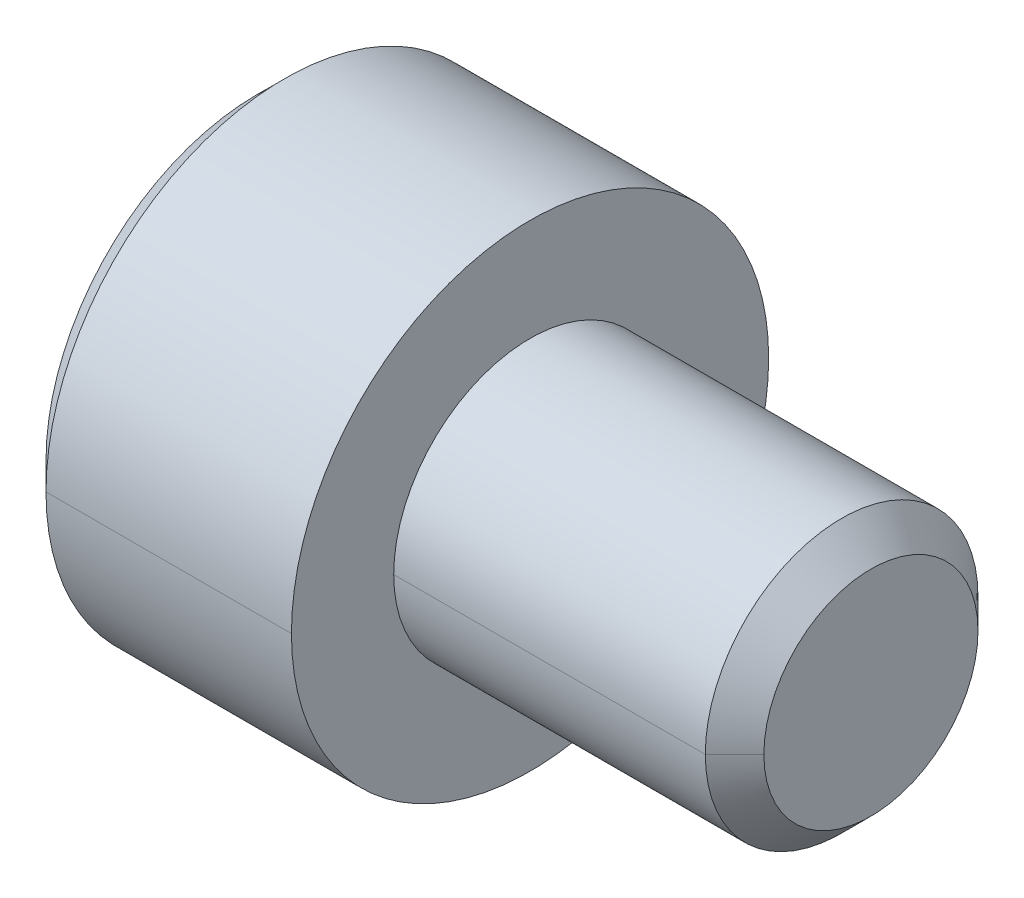
ISO-10303-21;
HEADER;
FILE_DESCRIPTION(('STEP AP214'),'2;1');
FILE_NAME('part.step','',(''),(''),'','','');
FILE_SCHEMA(('AUTOMOTIVE_DESIGN { 1 0 10303 214 1 1 1 1 }'));
ENDSEC;
DATA;
#1=APPLICATION_CONTEXT('core data for automotive mechanical design processes');
#2=APPLICATION_PROTOCOL_DEFINITION('international standard','automotive_design',2000,#1);
#3=PRODUCT_CONTEXT('',#1,'mechanical');
#4=PRODUCT('Part','Part','',(#3));
#5=PRODUCT_RELATED_PRODUCT_CATEGORY('part','',(#4));
#6=PRODUCT_DEFINITION_FORMATION('','',#4);
#7=PRODUCT_DEFINITION_CONTEXT('part definition',#1,'design');
#8=PRODUCT_DEFINITION('design','',#6,#7);
#9=PRODUCT_DEFINITION_SHAPE('','',#8);
#10=(LENGTH_UNIT() NAMED_UNIT(*) SI_UNIT(.MILLI.,.METRE.));
#11=(NAMED_UNIT(*) PLANE_ANGLE_UNIT() SI_UNIT($,.RADIAN.));
#12=(NAMED_UNIT(*) SI_UNIT($,.STERADIAN.) SOLID_ANGLE_UNIT());
#13=UNCERTAINTY_MEASURE_WITH_UNIT(LENGTH_MEASURE(1.E-05),#10,'distance_accuracy_value','');
#14=(GEOMETRIC_REPRESENTATION_CONTEXT(3) GLOBAL_UNCERTAINTY_ASSIGNED_CONTEXT((#13)) GLOBAL_UNIT_ASSIGNED_CONTEXT((#10,
#11,#12)) REPRESENTATION_CONTEXT('',''));
#15=CARTESIAN_POINT('',(0.,0.,0.));
#16=DIRECTION('',(0.,0.,1.));
#17=DIRECTION('',(1.,0.,0.));
#18=AXIS2_PLACEMENT_3D('',#15,#16,#17);
#19=CARTESIAN_POINT('',(-4.,0.,0.));
#20=DIRECTION('',(1.,0.,0.));
#21=DIRECTION('',(0.,-1.,0.));
#22=AXIS2_PLACEMENT_3D('',#19,#20,#21);
#23=CONICAL_SURFACE('',#22,3.1,0.7853981634);
#24=CARTESIAN_POINT('',(-3.6,0.,0.));
#25=DIRECTION('',(1.,0.,0.));
#26=DIRECTION('',(0.,0.,-1.));
#27=AXIS2_PLACEMENT_3D('',#24,#25,#26);
#28=CIRCLE('',#27,3.5);
#29=CARTESIAN_POINT('',(-3.6,0.,-3.5));
#30=VERTEX_POINT('',#29);
#31=CARTESIAN_POINT('',(-3.60000000000102,0.,3.50000000000102));
#32=VERTEX_POINT('',#31);
#33=EDGE_CURVE('E12',#30,#32,#28,.T.);
#34=ORIENTED_EDGE('',*,*,#33,.F.);
#35=DIRECTION('',(0.707106781184743,0.,-0.707106781188352));
#36=VECTOR('',#35,1.);
#37=CARTESIAN_POINT('',(-4.,0.,-3.1));
#38=LINE('',#37,#36);
#39=CARTESIAN_POINT('',(-4.,0.,-3.1));
#40=VERTEX_POINT('',#39);
#41=EDGE_CURVE('E29',#40,#30,#38,.T.);
#42=ORIENTED_EDGE('',*,*,#41,.F.);
#43=CARTESIAN_POINT('',(-4.,0.,0.));
#44=DIRECTION('',(1.,0.,0.));
#45=DIRECTION('',(0.,0.,-1.));
#46=AXIS2_PLACEMENT_3D('',#43,#44,#45);
#47=CIRCLE('',#46,3.1);
#48=CARTESIAN_POINT('',(-4.,0.,3.1));
#49=VERTEX_POINT('',#48);
#50=EDGE_CURVE('E199',#40,#49,#47,.T.);
#51=ORIENTED_EDGE('',*,*,#50,.T.);
#52=DIRECTION('',(0.707106781184743,0.,0.707106781188352));
#53=VECTOR('',#52,1.);
#54=CARTESIAN_POINT('',(-4.,0.,3.1));
#55=LINE('',#54,#53);
#56=EDGE_CURVE('E196',#49,#32,#55,.T.);
#57=ORIENTED_EDGE('',*,*,#56,.T.);
#58=EDGE_LOOP('',(#34,#42,#51,#57));
#59=FACE_BOUND('',#58,.T.);
#60=ADVANCED_FACE('F20',(#59),#23,.T.);
#61=CARTESIAN_POINT('',(-4.,0.,0.));
#62=DIRECTION('',(1.,0.,0.));
#63=DIRECTION('',(0.,1.,0.));
#64=AXIS2_PLACEMENT_3D('',#61,#62,#63);
#65=CONICAL_SURFACE('',#64,3.1,0.7853981634);
#66=CARTESIAN_POINT('',(-4.,0.,0.));
#67=DIRECTION('',(1.,0.,0.));
#68=DIRECTION('',(0.,0.,-1.));
#69=AXIS2_PLACEMENT_3D('',#66,#67,#68);
#70=CIRCLE('',#69,3.1);
#71=EDGE_CURVE('E195',#49,#40,#70,.T.);
#72=ORIENTED_EDGE('',*,*,#71,.T.);
#73=ORIENTED_EDGE('',*,*,#41,.T.);
#74=CARTESIAN_POINT('',(-3.6,0.,0.));
#75=DIRECTION('',(1.,0.,0.));
#76=DIRECTION('',(0.,0.,-1.));
#77=AXIS2_PLACEMENT_3D('',#74,#75,#76);
#78=CIRCLE('',#77,3.5);
#79=EDGE_CURVE('E443',#32,#30,#78,.T.);
#80=ORIENTED_EDGE('',*,*,#79,.F.);
#81=ORIENTED_EDGE('',*,*,#56,.F.);
#82=EDGE_LOOP('',(#72,#73,#80,#81));
#83=FACE_BOUND('',#82,.T.);
#84=ADVANCED_FACE('F459',(#83),#65,.T.);
#85=CARTESIAN_POINT('',(5.,0.,0.));
#86=DIRECTION('',(-1.,0.,0.));
#87=DIRECTION('',(0.,1.,0.));
#88=AXIS2_PLACEMENT_3D('',#85,#86,#87);
#89=CYLINDRICAL_SURFACE('',#88,3.5);
#90=ORIENTED_EDGE('',*,*,#79,.T.);
#91=DIRECTION('',(-1.,0.,0.));
#92=VECTOR('',#91,1.);
#93=CARTESIAN_POINT('',(0.,0.,-3.5));
#94=LINE('',#93,#92);
#95=CARTESIAN_POINT('',(0.,0.,-3.5));
#96=VERTEX_POINT('',#95);
#97=EDGE_CURVE('E437',#96,#30,#94,.T.);
#98=ORIENTED_EDGE('',*,*,#97,.F.);
#99=CARTESIAN_POINT('',(0.,0.,0.));
#100=DIRECTION('',(1.,0.,0.));
#101=DIRECTION('',(0.,0.,-1.));
#102=AXIS2_PLACEMENT_3D('',#99,#100,#101);
#103=CIRCLE('',#102,3.5);
#104=CARTESIAN_POINT('',(0.,0.,3.5));
#105=VERTEX_POINT('',#104);
#106=EDGE_CURVE('E433',#105,#96,#103,.T.);
#107=ORIENTED_EDGE('',*,*,#106,.F.);
#108=DIRECTION('',(-1.,0.,0.));
#109=VECTOR('',#108,1.);
#110=CARTESIAN_POINT('',(0.,0.,3.5));
#111=LINE('',#110,#109);
#112=EDGE_CURVE('E431',#105,#32,#111,.T.);
#113=ORIENTED_EDGE('',*,*,#112,.T.);
#114=EDGE_LOOP('',(#90,#98,#107,#113));
#115=FACE_BOUND('',#114,.T.);
#116=ADVANCED_FACE('F462',(#115),#89,.T.);
#117=CARTESIAN_POINT('',(5.,0.,0.));
#118=DIRECTION('',(-1.,0.,0.));
#119=DIRECTION('',(0.,-1.,0.));
#120=AXIS2_PLACEMENT_3D('',#117,#118,#119);
#121=CYLINDRICAL_SURFACE('',#120,3.5);
#122=CARTESIAN_POINT('',(0.,0.,0.));
#123=DIRECTION('',(1.,0.,0.));
#124=DIRECTION('',(0.,0.,-1.));
#125=AXIS2_PLACEMENT_3D('',#122,#123,#124);
#126=CIRCLE('',#125,3.5);
#127=EDGE_CURVE('E467',#96,#105,#126,.T.);
#128=ORIENTED_EDGE('',*,*,#127,.F.);
#129=ORIENTED_EDGE('',*,*,#97,.T.);
#130=ORIENTED_EDGE('',*,*,#33,.T.);
#131=ORIENTED_EDGE('',*,*,#112,.F.);
#132=EDGE_LOOP('',(#128,#129,#130,#131));
#133=FACE_BOUND('',#132,.T.);
#134=ADVANCED_FACE('F468',(#133),#121,.T.);
#135=CARTESIAN_POINT('',(0.,3.5,0.));
#136=DIRECTION('',(-1.,0.,0.));
#137=DIRECTION('',(0.,0.,1.));
#138=AXIS2_PLACEMENT_3D('',#135,#136,#137);
#139=PLANE('',#138);
#140=CARTESIAN_POINT('',(0.,0.,0.));
#141=DIRECTION('',(1.,0.,0.));
#142=DIRECTION('',(0.,0.,-1.));
#143=AXIS2_PLACEMENT_3D('',#140,#141,#142);
#144=CIRCLE('',#143,2.);
#145=CARTESIAN_POINT('',(0.,0.,-2.));
#146=VERTEX_POINT('',#145);
#147=CARTESIAN_POINT('',(0.,0.,2.));
#148=VERTEX_POINT('',#147);
#149=EDGE_CURVE('E471',#146,#148,#144,.T.);
#150=ORIENTED_EDGE('',*,*,#149,.F.);
#151=CARTESIAN_POINT('',(0.,0.,0.));
#152=DIRECTION('',(1.,0.,0.));
#153=DIRECTION('',(0.,0.,-1.));
#154=AXIS2_PLACEMENT_3D('',#151,#152,#153);
#155=CIRCLE('',#154,2.);
#156=EDGE_CURVE('E418',#148,#146,#155,.T.);
#157=ORIENTED_EDGE('',*,*,#156,.F.);
#158=EDGE_LOOP('',(#150,#157));
#159=FACE_BOUND('',#158,.T.);
#160=ORIENTED_EDGE('',*,*,#127,.T.);
#161=ORIENTED_EDGE('',*,*,#106,.T.);
#162=EDGE_LOOP('',(#160,#161));
#163=FACE_BOUND('',#162,.T.);
#164=ADVANCED_FACE('F473',(#159,#163),#139,.F.);
#165=CARTESIAN_POINT('',(5.,0.,0.));
#166=DIRECTION('',(-1.,0.,0.));
#167=DIRECTION('',(0.,1.,0.));
#168=AXIS2_PLACEMENT_3D('',#165,#166,#167);
#169=CYLINDRICAL_SURFACE('',#168,2.);
#170=ORIENTED_EDGE('',*,*,#156,.T.);
#171=DIRECTION('',(-1.,0.,0.));
#172=VECTOR('',#171,1.);
#173=CARTESIAN_POINT('',(4.5705,0.,-2.));
#174=LINE('',#173,#172);
#175=CARTESIAN_POINT('',(4.5705,0.,-2.));
#176=VERTEX_POINT('',#175);
#177=EDGE_CURVE('E413',#176,#146,#174,.T.);
#178=ORIENTED_EDGE('',*,*,#177,.F.);
#179=CARTESIAN_POINT('',(4.5705,0.,0.));
#180=DIRECTION('',(1.,0.,0.));
#181=DIRECTION('',(0.,0.,-1.));
#182=AXIS2_PLACEMENT_3D('',#179,#180,#181);
#183=CIRCLE('',#182,2.);
#184=CARTESIAN_POINT('',(4.5705,0.,2.));
#185=VERTEX_POINT('',#184);
#186=EDGE_CURVE('E412',#185,#176,#183,.T.);
#187=ORIENTED_EDGE('',*,*,#186,.F.);
#188=DIRECTION('',(-1.,0.,0.));
#189=VECTOR('',#188,1.);
#190=CARTESIAN_POINT('',(4.5705,0.,2.));
#191=LINE('',#190,#189);
#192=EDGE_CURVE('E397',#185,#148,#191,.T.);
#193=ORIENTED_EDGE('',*,*,#192,.T.);
#194=EDGE_LOOP('',(#170,#178,#187,#193));
#195=FACE_BOUND('',#194,.T.);
#196=ADVANCED_FACE('F475',(#195),#169,.T.);
#197=CARTESIAN_POINT('',(5.,0.,0.));
#198=DIRECTION('',(-1.,0.,0.));
#199=DIRECTION('',(0.,-1.,0.));
#200=AXIS2_PLACEMENT_3D('',#197,#198,#199);
#201=CYLINDRICAL_SURFACE('',#200,2.);
#202=CARTESIAN_POINT('',(4.5705,0.,0.));
#203=DIRECTION('',(1.,0.,0.));
#204=DIRECTION('',(0.,0.,-1.));
#205=AXIS2_PLACEMENT_3D('',#202,#203,#204);
#206=CIRCLE('',#205,2.);
#207=EDGE_CURVE('E390',#176,#185,#206,.T.);
#208=ORIENTED_EDGE('',*,*,#207,.F.);
#209=ORIENTED_EDGE('',*,*,#177,.T.);
#210=ORIENTED_EDGE('',*,*,#149,.T.);
#211=ORIENTED_EDGE('',*,*,#192,.F.);
#212=EDGE_LOOP('',(#208,#209,#210,#211));
#213=FACE_BOUND('',#212,.T.);
#214=ADVANCED_FACE('F483',(#213),#201,.T.);
#215=CARTESIAN_POINT('',(4.5705,0.,0.));
#216=DIRECTION('',(-1.,0.,0.));
#217=DIRECTION('',(0.,-1.,0.));
#218=AXIS2_PLACEMENT_3D('',#215,#216,#217);
#219=CONICAL_SURFACE('',#218,2.,0.7853981634);
#220=CARTESIAN_POINT('',(5.,0.,0.));
#221=DIRECTION('',(1.,0.,0.));
#222=DIRECTION('',(0.,0.,-1.));
#223=AXIS2_PLACEMENT_3D('',#220,#221,#222);
#224=CIRCLE('',#223,1.5705);
#225=CARTESIAN_POINT('',(5.,0.,-1.5705));
#226=VERTEX_POINT('',#225);
#227=CARTESIAN_POINT('',(4.9999999999989,0.,1.5704999999989));
#228=VERTEX_POINT('',#227);
#229=EDGE_CURVE('E384',#226,#228,#224,.T.);
#230=ORIENTED_EDGE('',*,*,#229,.F.);
#231=DIRECTION('',(-0.707106781184742,0.,-0.707106781188353));
#232=VECTOR('',#231,1.);
#233=CARTESIAN_POINT('',(4.9999999999989,0.,-1.5704999999989));
#234=LINE('',#233,#232);
#235=EDGE_CURVE('E380',#226,#176,#234,.T.);
#236=ORIENTED_EDGE('',*,*,#235,.T.);
#237=ORIENTED_EDGE('',*,*,#207,.T.);
#238=DIRECTION('',(-0.707106781184742,0.,0.707106781188353));
#239=VECTOR('',#238,1.);
#240=CARTESIAN_POINT('',(4.9999999999989,0.,1.5704999999989));
#241=LINE('',#240,#239);
#242=EDGE_CURVE('E360',#228,#185,#241,.T.);
#243=ORIENTED_EDGE('',*,*,#242,.F.);
#244=EDGE_LOOP('',(#230,#236,#237,#243));
#245=FACE_BOUND('',#244,.T.);
#246=ADVANCED_FACE('F520',(#245),#219,.T.);
#247=CARTESIAN_POINT('',(4.5705,0.,0.));
#248=DIRECTION('',(-1.,0.,0.));
#249=DIRECTION('',(0.,1.,0.));
#250=AXIS2_PLACEMENT_3D('',#247,#248,#249);
#251=CONICAL_SURFACE('',#250,2.,0.7853981634);
#252=ORIENTED_EDGE('',*,*,#186,.T.);
#253=ORIENTED_EDGE('',*,*,#235,.F.);
#254=CARTESIAN_POINT('',(5.,0.,0.));
#255=DIRECTION('',(1.,0.,0.));
#256=DIRECTION('',(0.,0.,-1.));
#257=AXIS2_PLACEMENT_3D('',#254,#255,#256);
#258=CIRCLE('',#257,1.5705);
#259=EDGE_CURVE('E354',#228,#226,#258,.T.);
#260=ORIENTED_EDGE('',*,*,#259,.F.);
#261=ORIENTED_EDGE('',*,*,#242,.T.);
#262=EDGE_LOOP('',(#252,#253,#260,#261));
#263=FACE_BOUND('',#262,.T.);
#264=ADVANCED_FACE('F529',(#263),#251,.T.);
#265=CARTESIAN_POINT('',(5.,1.5705,0.));
#266=DIRECTION('',(-1.,0.,0.));
#267=DIRECTION('',(0.,0.,1.));
#268=AXIS2_PLACEMENT_3D('',#265,#266,#267);
#269=PLANE('',#268);
#270=ORIENTED_EDGE('',*,*,#229,.T.);
#271=ORIENTED_EDGE('',*,*,#259,.T.);
#272=EDGE_LOOP('',(#270,#271));
#273=FACE_BOUND('',#272,.T.);
#274=ADVANCED_FACE('F538',(#273),#269,.F.);
#275=CARTESIAN_POINT('',(-4.,0.,0.));
#276=DIRECTION('',(1.,0.,0.));
#277=DIRECTION('',(0.,0.,-1.));
#278=AXIS2_PLACEMENT_3D('',#275,#276,#277);
#279=PLANE('',#278);
#280=ORIENTED_EDGE('',*,*,#50,.F.);
#281=ORIENTED_EDGE('',*,*,#71,.F.);
#282=EDGE_LOOP('',(#280,#281));
#283=FACE_BOUND('',#282,.T.);
#284=DIRECTION('',(0.,0.500000000000009,-0.866025403784433));
#285=VECTOR('',#284,1.);
#286=CARTESIAN_POINT('',(-4.,-1.7320508075689,0.));
#287=LINE('',#286,#285);
#288=CARTESIAN_POINT('',(-4.,-1.7320508075689,0.));
#289=VERTEX_POINT('',#288);
#290=CARTESIAN_POINT('',(-4.,-0.86602540378444,-1.5));
#291=VERTEX_POINT('',#290);
#292=EDGE_CURVE('E343',#289,#291,#287,.T.);
#293=ORIENTED_EDGE('',*,*,#292,.T.);
#294=DIRECTION('',(0.,1.,0.));
#295=VECTOR('',#294,1.);
#296=CARTESIAN_POINT('',(-4.,-0.86602540378444,-1.5));
#297=LINE('',#296,#295);
#298=CARTESIAN_POINT('',(-4.,0.86602540378444,-1.5));
#299=VERTEX_POINT('',#298);
#300=EDGE_CURVE('E355',#291,#299,#297,.T.);
#301=ORIENTED_EDGE('',*,*,#300,.T.);
#302=DIRECTION('',(0.,0.500000000000009,0.866025403784433));
#303=VECTOR('',#302,1.);
#304=CARTESIAN_POINT('',(-4.,0.86602540378444,-1.5));
#305=LINE('',#304,#303);
#306=CARTESIAN_POINT('',(-4.,1.7320508075689,0.));
#307=VERTEX_POINT('',#306);
#308=EDGE_CURVE('E362',#299,#307,#305,.T.);
#309=ORIENTED_EDGE('',*,*,#308,.T.);
#310=DIRECTION('',(0.,-0.500000000000009,0.866025403784433));
#311=VECTOR('',#310,1.);
#312=CARTESIAN_POINT('',(-4.,1.7320508075689,0.));
#313=LINE('',#312,#311);
#314=CARTESIAN_POINT('',(-4.,0.86602540378444,1.5));
#315=VERTEX_POINT('',#314);
#316=EDGE_CURVE('E227',#307,#315,#313,.T.);
#317=ORIENTED_EDGE('',*,*,#316,.T.);
#318=DIRECTION('',(0.,-1.,0.));
#319=VECTOR('',#318,1.);
#320=CARTESIAN_POINT('',(-4.,0.86602540378444,1.5));
#321=LINE('',#320,#319);
#322=CARTESIAN_POINT('',(-4.,-0.86602540378444,1.5));
#323=VERTEX_POINT('',#322);
#324=EDGE_CURVE('E223',#315,#323,#321,.T.);
#325=ORIENTED_EDGE('',*,*,#324,.T.);
#326=DIRECTION('',(0.,-0.500000000000009,-0.866025403784433));
#327=VECTOR('',#326,1.);
#328=CARTESIAN_POINT('',(-4.,-0.86602540378444,1.5));
#329=LINE('',#328,#327);
#330=EDGE_CURVE('E221',#323,#289,#329,.T.);
#331=ORIENTED_EDGE('',*,*,#330,.T.);
#332=EDGE_LOOP('',(#293,#301,#309,#317,#325,#331));
#333=FACE_BOUND('',#332,.T.);
#334=ADVANCED_FACE('F341',(#283,#333),#279,.F.);
#335=CARTESIAN_POINT('',(-2.,-0.86602540378444,1.5));
#336=DIRECTION('',(0.,0.866025403784433,-0.500000000000009));
#337=DIRECTION('',(0.,0.500000000000009,0.866025403784433));
#338=AXIS2_PLACEMENT_3D('',#335,#336,#337);
#339=PLANE('',#338);
#340=ORIENTED_EDGE('',*,*,#330,.F.);
#341=DIRECTION('',(-1.,0.,0.));
#342=VECTOR('',#341,1.);
#343=CARTESIAN_POINT('',(-2.,-0.86602540378444,1.5));
#344=LINE('',#343,#342);
#345=CARTESIAN_POINT('',(-2.,-0.86602540378444,1.5));
#346=VERTEX_POINT('',#345);
#347=EDGE_CURVE('E330',#346,#323,#344,.T.);
#348=ORIENTED_EDGE('',*,*,#347,.F.);
#349=DIRECTION('',(0.,-0.500000000000009,-0.866025403784433));
#350=VECTOR('',#349,1.);
#351=CARTESIAN_POINT('',(-2.,-0.86602540378444,1.5));
#352=LINE('',#351,#350);
#353=CARTESIAN_POINT('',(-2.,-1.29903810567666,0.750000000000019));
#354=VERTEX_POINT('',#353);
#355=EDGE_CURVE('E325',#346,#354,#352,.T.);
#356=ORIENTED_EDGE('',*,*,#355,.T.);
#357=DIRECTION('',(0.,-0.500000000000009,-0.866025403784433));
#358=VECTOR('',#357,1.);
#359=CARTESIAN_POINT('',(-2.,-0.86602540378444,1.5));
#360=LINE('',#359,#358);
#361=CARTESIAN_POINT('',(-2.,-1.7320508075689,0.));
#362=VERTEX_POINT('',#361);
#363=EDGE_CURVE('E320',#354,#362,#360,.T.);
#364=ORIENTED_EDGE('',*,*,#363,.T.);
#365=DIRECTION('',(-1.,0.,0.));
#366=VECTOR('',#365,1.);
#367=CARTESIAN_POINT('',(-2.,-1.7320508075689,0.));
#368=LINE('',#367,#366);
#369=EDGE_CURVE('E314',#362,#289,#368,.T.);
#370=ORIENTED_EDGE('',*,*,#369,.T.);
#371=EDGE_LOOP('',(#340,#348,#356,#364,#370));
#372=FACE_BOUND('',#371,.T.);
#373=ADVANCED_FACE('F346',(#372),#339,.T.);
#374=CARTESIAN_POINT('',(-2.,-1.7320508075689,0.));
#375=DIRECTION('',(0.,0.866025403784433,0.500000000000009));
#376=DIRECTION('',(0.,-0.500000000000009,0.866025403784433));
#377=AXIS2_PLACEMENT_3D('',#374,#375,#376);
#378=PLANE('',#377);
#379=ORIENTED_EDGE('',*,*,#292,.F.);
#380=ORIENTED_EDGE('',*,*,#369,.F.);
#381=DIRECTION('',(0.,0.500000000000009,-0.866025403784433));
#382=VECTOR('',#381,1.);
#383=CARTESIAN_POINT('',(-2.,-1.7320508075689,0.));
#384=LINE('',#383,#382);
#385=CARTESIAN_POINT('',(-2.,-1.29903810567665,-0.750000000000014));
#386=VERTEX_POINT('',#385);
#387=EDGE_CURVE('E309',#362,#386,#384,.T.);
#388=ORIENTED_EDGE('',*,*,#387,.T.);
#389=DIRECTION('',(0.,0.500000000000009,-0.866025403784433));
#390=VECTOR('',#389,1.);
#391=CARTESIAN_POINT('',(-2.,-1.7320508075689,0.));
#392=LINE('',#391,#390);
#393=CARTESIAN_POINT('',(-2.,-0.86602540378444,-1.5));
#394=VERTEX_POINT('',#393);
#395=EDGE_CURVE('E304',#386,#394,#392,.T.);
#396=ORIENTED_EDGE('',*,*,#395,.T.);
#397=DIRECTION('',(-1.,0.,0.));
#398=VECTOR('',#397,1.);
#399=CARTESIAN_POINT('',(-2.,-0.86602540378444,-1.5));
#400=LINE('',#399,#398);
#401=EDGE_CURVE('E298',#394,#291,#400,.T.);
#402=ORIENTED_EDGE('',*,*,#401,.T.);
#403=EDGE_LOOP('',(#379,#380,#388,#396,#402));
#404=FACE_BOUND('',#403,.T.);
#405=ADVANCED_FACE('F350',(#404),#378,.T.);
#406=CARTESIAN_POINT('',(-2.,-0.86602540378444,-1.5));
#407=DIRECTION('',(0.,0.,1.));
#408=DIRECTION('',(1.,0.,0.));
#409=AXIS2_PLACEMENT_3D('',#406,#407,#408);
#410=PLANE('',#409);
#411=ORIENTED_EDGE('',*,*,#300,.F.);
#412=ORIENTED_EDGE('',*,*,#401,.F.);
#413=DIRECTION('',(0.,1.,0.));
#414=VECTOR('',#413,1.);
#415=CARTESIAN_POINT('',(-2.,-0.86602540378444,-1.5));
#416=LINE('',#415,#414);
#417=CARTESIAN_POINT('',(-2.,0.,-1.5));
#418=VERTEX_POINT('',#417);
#419=EDGE_CURVE('E293',#394,#418,#416,.T.);
#420=ORIENTED_EDGE('',*,*,#419,.T.);
#421=DIRECTION('',(0.,1.,0.));
#422=VECTOR('',#421,1.);
#423=CARTESIAN_POINT('',(-2.,-0.86602540378444,-1.5));
#424=LINE('',#423,#422);
#425=CARTESIAN_POINT('',(-2.,0.86602540378444,-1.5));
#426=VERTEX_POINT('',#425);
#427=EDGE_CURVE('E288',#418,#426,#424,.T.);
#428=ORIENTED_EDGE('',*,*,#427,.T.);
#429=DIRECTION('',(-1.,0.,0.));
#430=VECTOR('',#429,1.);
#431=CARTESIAN_POINT('',(-2.,0.86602540378444,-1.5));
#432=LINE('',#431,#430);
#433=EDGE_CURVE('E282',#426,#299,#432,.T.);
#434=ORIENTED_EDGE('',*,*,#433,.T.);
#435=EDGE_LOOP('',(#411,#412,#420,#428,#434));
#436=FACE_BOUND('',#435,.T.);
#437=ADVANCED_FACE('F569',(#436),#410,.T.);
#438=CARTESIAN_POINT('',(-2.,0.86602540378444,-1.5));
#439=DIRECTION('',(0.,-0.866025403784433,0.500000000000009));
#440=DIRECTION('',(0.,-0.500000000000009,-0.866025403784433));
#441=AXIS2_PLACEMENT_3D('',#438,#439,#440);
#442=PLANE('',#441);
#443=ORIENTED_EDGE('',*,*,#308,.F.);
#444=ORIENTED_EDGE('',*,*,#433,.F.);
#445=DIRECTION('',(0.,0.500000000000009,0.866025403784433));
#446=VECTOR('',#445,1.);
#447=CARTESIAN_POINT('',(-2.,0.86602540378444,-1.5));
#448=LINE('',#447,#446);
#449=CARTESIAN_POINT('',(-2.,1.29903810567666,-0.750000000000019));
#450=VERTEX_POINT('',#449);
#451=EDGE_CURVE('E276',#426,#450,#448,.T.);
#452=ORIENTED_EDGE('',*,*,#451,.T.);
#453=DIRECTION('',(0.,0.500000000000009,0.866025403784433));
#454=VECTOR('',#453,1.);
#455=CARTESIAN_POINT('',(-2.,0.86602540378444,-1.5));
#456=LINE('',#455,#454);
#457=CARTESIAN_POINT('',(-2.,1.7320508075689,0.));
#458=VERTEX_POINT('',#457);
#459=EDGE_CURVE('E271',#450,#458,#456,.T.);
#460=ORIENTED_EDGE('',*,*,#459,.T.);
#461=DIRECTION('',(-1.,0.,0.));
#462=VECTOR('',#461,1.);
#463=CARTESIAN_POINT('',(-2.,1.7320508075689,0.));
#464=LINE('',#463,#462);
#465=EDGE_CURVE('E265',#458,#307,#464,.T.);
#466=ORIENTED_EDGE('',*,*,#465,.T.);
#467=EDGE_LOOP('',(#443,#444,#452,#460,#466));
#468=FACE_BOUND('',#467,.T.);
#469=ADVANCED_FACE('F577',(#468),#442,.T.);
#470=CARTESIAN_POINT('',(-2.,1.7320508075689,0.));
#471=DIRECTION('',(0.,-0.866025403784433,-0.500000000000009));
#472=DIRECTION('',(0.,0.500000000000009,-0.866025403784433));
#473=AXIS2_PLACEMENT_3D('',#470,#471,#472);
#474=PLANE('',#473);
#475=ORIENTED_EDGE('',*,*,#316,.F.);
#476=ORIENTED_EDGE('',*,*,#465,.F.);
#477=DIRECTION('',(0.,-0.500000000000009,0.866025403784433));
#478=VECTOR('',#477,1.);
#479=CARTESIAN_POINT('',(-2.,1.7320508075689,0.));
#480=LINE('',#479,#478);
#481=CARTESIAN_POINT('',(-2.,1.29903810567666,0.750000000000019));
#482=VERTEX_POINT('',#481);
#483=EDGE_CURVE('E260',#458,#482,#480,.T.);
#484=ORIENTED_EDGE('',*,*,#483,.T.);
#485=DIRECTION('',(0.,-0.500000000000009,0.866025403784433));
#486=VECTOR('',#485,1.);
#487=CARTESIAN_POINT('',(-2.,1.7320508075689,0.));
#488=LINE('',#487,#486);
#489=CARTESIAN_POINT('',(-2.,0.86602540378444,1.5));
#490=VERTEX_POINT('',#489);
#491=EDGE_CURVE('E255',#482,#490,#488,.T.);
#492=ORIENTED_EDGE('',*,*,#491,.T.);
#493=DIRECTION('',(-1.,0.,0.));
#494=VECTOR('',#493,1.);
#495=CARTESIAN_POINT('',(-2.,0.86602540378444,1.5));
#496=LINE('',#495,#494);
#497=EDGE_CURVE('E249',#490,#315,#496,.T.);
#498=ORIENTED_EDGE('',*,*,#497,.T.);
#499=EDGE_LOOP('',(#475,#476,#484,#492,#498));
#500=FACE_BOUND('',#499,.T.);
#501=ADVANCED_FACE('F586',(#500),#474,.T.);
#502=CARTESIAN_POINT('',(-2.,0.86602540378444,1.5));
#503=DIRECTION('',(0.,0.,-1.));
#504=DIRECTION('',(-1.,0.,0.));
#505=AXIS2_PLACEMENT_3D('',#502,#503,#504);
#506=PLANE('',#505);
#507=ORIENTED_EDGE('',*,*,#324,.F.);
#508=ORIENTED_EDGE('',*,*,#497,.F.);
#509=DIRECTION('',(0.,-1.,0.));
#510=VECTOR('',#509,1.);
#511=CARTESIAN_POINT('',(-2.,0.86602540378444,1.5));
#512=LINE('',#511,#510);
#513=CARTESIAN_POINT('',(-2.,0.,1.5));
#514=VERTEX_POINT('',#513);
#515=EDGE_CURVE('E244',#490,#514,#512,.T.);
#516=ORIENTED_EDGE('',*,*,#515,.T.);
#517=DIRECTION('',(0.,-1.,0.));
#518=VECTOR('',#517,1.);
#519=CARTESIAN_POINT('',(-2.,0.86602540378444,1.5));
#520=LINE('',#519,#518);
#521=EDGE_CURVE('E154',#514,#346,#520,.T.);
#522=ORIENTED_EDGE('',*,*,#521,.T.);
#523=ORIENTED_EDGE('',*,*,#347,.T.);
#524=EDGE_LOOP('',(#507,#508,#516,#522,#523));
#525=FACE_BOUND('',#524,.T.);
#526=ADVANCED_FACE('F595',(#525),#506,.T.);
#527=CARTESIAN_POINT('',(-2.,0.,0.));
#528=DIRECTION('',(1.,0.,0.));
#529=DIRECTION('',(0.,0.,-1.));
#530=AXIS2_PLACEMENT_3D('',#527,#528,#529);
#531=PLANE('',#530);
#532=CARTESIAN_POINT('',(-2.,0.,0.));
#533=DIRECTION('',(1.,0.,0.));
#534=DIRECTION('',(0.,0.,-1.));
#535=AXIS2_PLACEMENT_3D('',#532,#533,#534);
#536=CIRCLE('',#535,1.5);
#537=EDGE_CURVE('E135',#514,#354,#536,.T.);
#538=ORIENTED_EDGE('',*,*,#537,.T.);
#539=ORIENTED_EDGE('',*,*,#355,.F.);
#540=ORIENTED_EDGE('',*,*,#521,.F.);
#541=EDGE_LOOP('',(#538,#539,#540));
#542=FACE_BOUND('',#541,.T.);
#543=ADVANCED_FACE('F604',(#542),#531,.F.);
#544=CARTESIAN_POINT('',(-2.,0.,0.));
#545=DIRECTION('',(-1.,0.,0.));
#546=DIRECTION('',(0.,1.,0.));
#547=AXIS2_PLACEMENT_3D('',#544,#545,#546);
#548=CONICAL_SURFACE('',#547,1.5,1.308996939);
#549=DIRECTION('',(-0.258819045098413,0.,-0.965925826290169));
#550=VECTOR('',#549,1.);
#551=CARTESIAN_POINT('',(-1.59807621136015,0.,0.));
#552=LINE('',#551,#550);
#553=CARTESIAN_POINT('',(-1.5980762113533,0.,0.));
#554=VERTEX_POINT('',#553);
#555=EDGE_CURVE('E131',#554,#418,#552,.T.);
#556=ORIENTED_EDGE('',*,*,#555,.T.);
#557=CARTESIAN_POINT('',(-2.,0.,0.));
#558=DIRECTION('',(1.,0.,0.));
#559=DIRECTION('',(0.,0.,-1.));
#560=AXIS2_PLACEMENT_3D('',#557,#558,#559);
#561=CIRCLE('',#560,1.5);
#562=EDGE_CURVE('E149',#386,#418,#561,.T.);
#563=ORIENTED_EDGE('',*,*,#562,.F.);
#564=CARTESIAN_POINT('',(-2.,0.,0.));
#565=DIRECTION('',(1.,0.,0.));
#566=DIRECTION('',(0.,0.,-1.));
#567=AXIS2_PLACEMENT_3D('',#564,#565,#566);
#568=CIRCLE('',#567,1.5);
#569=EDGE_CURVE('E140',#354,#386,#568,.T.);
#570=ORIENTED_EDGE('',*,*,#569,.F.);
#571=ORIENTED_EDGE('',*,*,#537,.F.);
#572=DIRECTION('',(-0.258819045098413,0.,0.965925826290169));
#573=VECTOR('',#572,1.);
#574=CARTESIAN_POINT('',(-1.59807621136015,0.,0.));
#575=LINE('',#574,#573);
#576=EDGE_CURVE('E127',#554,#514,#575,.T.);
#577=ORIENTED_EDGE('',*,*,#576,.F.);
#578=EDGE_LOOP('',(#556,#563,#570,#571,#577));
#579=FACE_BOUND('',#578,.T.);
#580=ADVANCED_FACE('F129',(#579),#548,.F.);
#581=CARTESIAN_POINT('',(-2.,0.,0.));
#582=DIRECTION('',(-1.,0.,0.));
#583=DIRECTION('',(0.,-1.,0.));
#584=AXIS2_PLACEMENT_3D('',#581,#582,#583);
#585=CONICAL_SURFACE('',#584,1.5,1.308996939);
#586=ORIENTED_EDGE('',*,*,#576,.T.);
#587=CARTESIAN_POINT('',(-2.,0.,0.));
#588=DIRECTION('',(1.,0.,0.));
#589=DIRECTION('',(0.,0.,-1.));
#590=AXIS2_PLACEMENT_3D('',#587,#588,#589);
#591=CIRCLE('',#590,1.5);
#592=EDGE_CURVE('E141',#482,#514,#591,.T.);
#593=ORIENTED_EDGE('',*,*,#592,.F.);
#594=CARTESIAN_POINT('',(-2.,0.,0.));
#595=DIRECTION('',(1.,0.,0.));
#596=DIRECTION('',(0.,0.,-1.));
#597=AXIS2_PLACEMENT_3D('',#594,#595,#596);
#598=CIRCLE('',#597,1.5);
#599=EDGE_CURVE('E809',#450,#482,#598,.T.);
#600=ORIENTED_EDGE('',*,*,#599,.F.);
#601=CARTESIAN_POINT('',(-2.,0.,0.));
#602=DIRECTION('',(1.,0.,0.));
#603=DIRECTION('',(0.,0.,-1.));
#604=AXIS2_PLACEMENT_3D('',#601,#602,#603);
#605=CIRCLE('',#604,1.5);
#606=EDGE_CURVE('E146',#418,#450,#605,.T.);
#607=ORIENTED_EDGE('',*,*,#606,.F.);
#608=ORIENTED_EDGE('',*,*,#555,.F.);
#609=EDGE_LOOP('',(#586,#593,#600,#607,#608));
#610=FACE_BOUND('',#609,.T.);
#611=ADVANCED_FACE('F143',(#610),#585,.F.);
#612=CARTESIAN_POINT('',(-2.,0.,0.));
#613=DIRECTION('',(1.,0.,0.));
#614=DIRECTION('',(0.,0.,-1.));
#615=AXIS2_PLACEMENT_3D('',#612,#613,#614);
#616=PLANE('',#615);
#617=ORIENTED_EDGE('',*,*,#606,.T.);
#618=ORIENTED_EDGE('',*,*,#451,.F.);
#619=ORIENTED_EDGE('',*,*,#427,.F.);
#620=EDGE_LOOP('',(#617,#618,#619));
#621=FACE_BOUND('',#620,.T.);
#622=ADVANCED_FACE('F627',(#621),#616,.F.);
#623=CARTESIAN_POINT('',(-2.,0.,0.));
#624=DIRECTION('',(1.,0.,0.));
#625=DIRECTION('',(0.,0.,-1.));
#626=AXIS2_PLACEMENT_3D('',#623,#624,#625);
#627=PLANE('',#626);
#628=ORIENTED_EDGE('',*,*,#459,.F.);
#629=ORIENTED_EDGE('',*,*,#599,.T.);
#630=ORIENTED_EDGE('',*,*,#483,.F.);
#631=EDGE_LOOP('',(#628,#629,#630));
#632=FACE_BOUND('',#631,.T.);
#633=ADVANCED_FACE('F635',(#632),#627,.F.);
#634=CARTESIAN_POINT('',(-2.,0.,0.));
#635=DIRECTION('',(1.,0.,0.));
#636=DIRECTION('',(0.,0.,-1.));
#637=AXIS2_PLACEMENT_3D('',#634,#635,#636);
#638=PLANE('',#637);
#639=ORIENTED_EDGE('',*,*,#592,.T.);
#640=ORIENTED_EDGE('',*,*,#515,.F.);
#641=ORIENTED_EDGE('',*,*,#491,.F.);
#642=EDGE_LOOP('',(#639,#640,#641));
#643=FACE_BOUND('',#642,.T.);
#644=ADVANCED_FACE('F644',(#643),#638,.F.);
#645=CARTESIAN_POINT('',(-2.,0.,0.));
#646=DIRECTION('',(1.,0.,0.));
#647=DIRECTION('',(0.,0.,-1.));
#648=AXIS2_PLACEMENT_3D('',#645,#646,#647);
#649=PLANE('',#648);
#650=ORIENTED_EDGE('',*,*,#569,.T.);
#651=ORIENTED_EDGE('',*,*,#387,.F.);
#652=ORIENTED_EDGE('',*,*,#363,.F.);
#653=EDGE_LOOP('',(#650,#651,#652));
#654=FACE_BOUND('',#653,.T.);
#655=ADVANCED_FACE('F653',(#654),#649,.F.);
#656=CARTESIAN_POINT('',(-2.,0.,0.));
#657=DIRECTION('',(1.,0.,0.));
#658=DIRECTION('',(0.,0.,-1.));
#659=AXIS2_PLACEMENT_3D('',#656,#657,#658);
#660=PLANE('',#659);
#661=ORIENTED_EDGE('',*,*,#562,.T.);
#662=ORIENTED_EDGE('',*,*,#419,.F.);
#663=ORIENTED_EDGE('',*,*,#395,.F.);
#664=EDGE_LOOP('',(#661,#662,#663));
#665=FACE_BOUND('',#664,.T.);
#666=ADVANCED_FACE('F662',(#665),#660,.F.);
#667=CLOSED_SHELL('',(#60,#84,#116,#134,#164,#196,#214,#246,#264,#274,#334,#373,#405,#437,#469,
#501,#526,#543,#580,#611,#622,#633,#644,#655,#666));
#668=MANIFOLD_SOLID_BREP('B1',#667);
#669=ADVANCED_BREP_SHAPE_REPRESENTATION('',(#18,#668),#14);
#670=SHAPE_DEFINITION_REPRESENTATION(#9,#669);
ENDSEC;
END-ISO-10303-21;
